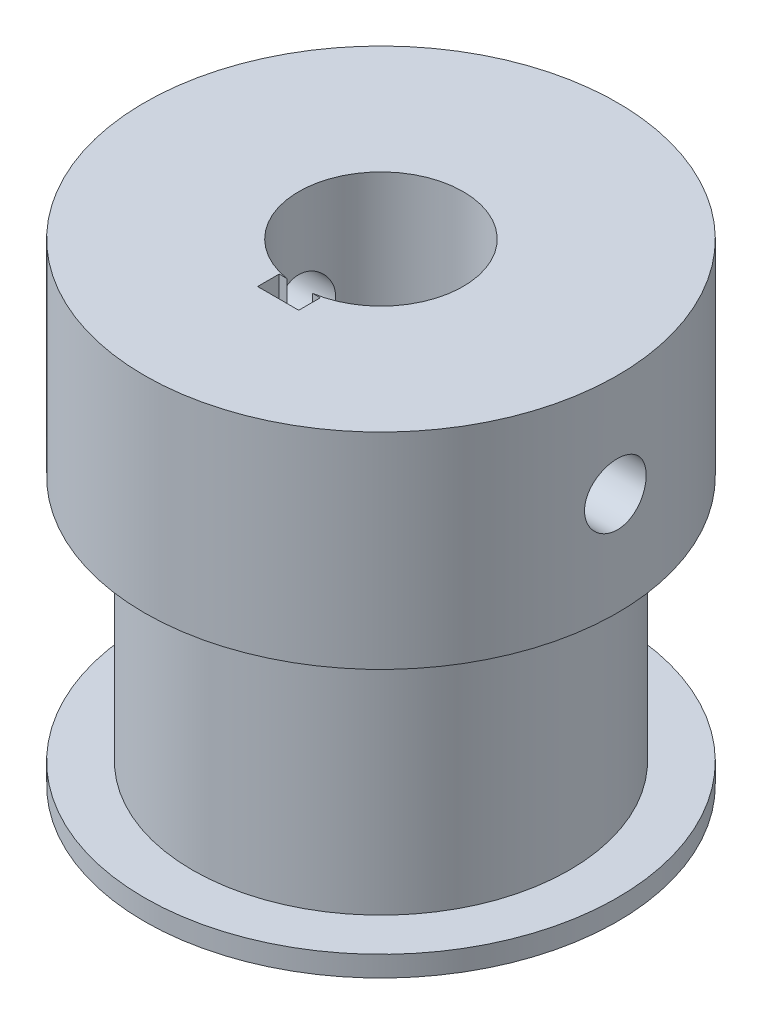
ISO-10303-21;
HEADER;
FILE_DESCRIPTION(('STEP AP214'),'2;1');
FILE_NAME('part.step','',(''),(''),'','','');
FILE_SCHEMA(('AUTOMOTIVE_DESIGN { 1 0 10303 214 1 1 1 1 }'));
ENDSEC;
DATA;
#1=APPLICATION_CONTEXT('core data for automotive mechanical design processes');
#2=APPLICATION_PROTOCOL_DEFINITION('international standard','automotive_design',2000,#1);
#3=PRODUCT_CONTEXT('',#1,'mechanical');
#4=PRODUCT('Part','Part','',(#3));
#5=PRODUCT_RELATED_PRODUCT_CATEGORY('part','',(#4));
#6=PRODUCT_DEFINITION_FORMATION('','',#4);
#7=PRODUCT_DEFINITION_CONTEXT('part definition',#1,'design');
#8=PRODUCT_DEFINITION('design','',#6,#7);
#9=PRODUCT_DEFINITION_SHAPE('','',#8);
#10=(LENGTH_UNIT() NAMED_UNIT(*) SI_UNIT(.MILLI.,.METRE.));
#11=(NAMED_UNIT(*) PLANE_ANGLE_UNIT() SI_UNIT($,.RADIAN.));
#12=(NAMED_UNIT(*) SI_UNIT($,.STERADIAN.) SOLID_ANGLE_UNIT());
#13=UNCERTAINTY_MEASURE_WITH_UNIT(LENGTH_MEASURE(1.E-05),#10,'distance_accuracy_value','');
#14=(GEOMETRIC_REPRESENTATION_CONTEXT(3) GLOBAL_UNCERTAINTY_ASSIGNED_CONTEXT((#13)) GLOBAL_UNIT_ASSIGNED_CONTEXT((#10,
#11,#12)) REPRESENTATION_CONTEXT('',''));
#15=CARTESIAN_POINT('',(0.,0.,0.));
#16=DIRECTION('',(0.,0.,1.));
#17=DIRECTION('',(1.,0.,0.));
#18=AXIS2_PLACEMENT_3D('',#15,#16,#17);
#19=CARTESIAN_POINT('',(11.5127,0.008000000000038,11.512703548781));
#20=DIRECTION('',(0.,1.,0.));
#21=DIRECTION('',(0.,0.,1.));
#22=AXIS2_PLACEMENT_3D('',#19,#20,#21);
#23=CYLINDRICAL_SURFACE('',#22,11.5);
#24=CARTESIAN_POINT('',(11.5127,0.008000000000038,11.512703548781));
#25=DIRECTION('',(0.,1.,0.));
#26=DIRECTION('',(0.,0.,1.));
#27=AXIS2_PLACEMENT_3D('',#24,#25,#26);
#28=CIRCLE('',#27,11.5);
#29=CARTESIAN_POINT('',(11.5127,0.008000000000038,23.012703548781));
#30=VERTEX_POINT('',#29);
#31=EDGE_CURVE('E19',#30,#30,#28,.T.);
#32=ORIENTED_EDGE('',*,*,#31,.T.);
#33=EDGE_LOOP('',(#32));
#34=FACE_BOUND('',#33,.T.);
#35=CARTESIAN_POINT('',(11.5127,1.008,11.512703548781));
#36=DIRECTION('',(0.,1.,0.));
#37=DIRECTION('',(0.,0.,1.));
#38=AXIS2_PLACEMENT_3D('',#35,#36,#37);
#39=CIRCLE('',#38,11.5);
#40=CARTESIAN_POINT('',(11.5127,1.008,23.012703548781));
#41=VERTEX_POINT('',#40);
#42=EDGE_CURVE('E84',#41,#41,#39,.T.);
#43=ORIENTED_EDGE('',*,*,#42,.F.);
#44=EDGE_LOOP('',(#43));
#45=FACE_BOUND('',#44,.T.);
#46=ADVANCED_FACE('F16',(#34,#45),#23,.T.);
#47=CARTESIAN_POINT('',(11.5127,1.008,11.512703548781));
#48=DIRECTION('',(0.,1.,0.));
#49=DIRECTION('',(0.,0.,1.));
#50=AXIS2_PLACEMENT_3D('',#47,#48,#49);
#51=PLANE('',#50);
#52=CARTESIAN_POINT('',(11.5127,1.008,11.512703548781));
#53=DIRECTION('',(0.,1.,0.));
#54=DIRECTION('',(0.,0.,1.));
#55=AXIS2_PLACEMENT_3D('',#52,#53,#54);
#56=CIRCLE('',#55,9.168296585514);
#57=CARTESIAN_POINT('',(11.5127,1.008,20.681000134295));
#58=VERTEX_POINT('',#57);
#59=EDGE_CURVE('E123',#58,#58,#56,.T.);
#60=ORIENTED_EDGE('',*,*,#59,.F.);
#61=EDGE_LOOP('',(#60));
#62=FACE_BOUND('',#61,.T.);
#63=ORIENTED_EDGE('',*,*,#42,.T.);
#64=EDGE_LOOP('',(#63));
#65=FACE_BOUND('',#64,.T.);
#66=ADVANCED_FACE('F199',(#62,#65),#51,.T.);
#67=CARTESIAN_POINT('',(11.5127,0.008000000000038,11.512703548781));
#68=DIRECTION('',(0.,1.,0.));
#69=DIRECTION('',(0.,0.,1.));
#70=AXIS2_PLACEMENT_3D('',#67,#68,#69);
#71=PLANE('',#70);
#72=DIRECTION('',(0.,0.,1.));
#73=VECTOR('',#72,1.);
#74=CARTESIAN_POINT('',(10.5127,0.008000000000038,15.462703548781));
#75=LINE('',#74,#73);
#76=CARTESIAN_POINT('',(10.5127,0.008000000000038,15.462703548781));
#77=VERTEX_POINT('',#76);
#78=CARTESIAN_POINT('',(10.5127,0.008000000000038,16.512703548781));
#79=VERTEX_POINT('',#78);
#80=EDGE_CURVE('E101',#77,#79,#75,.T.);
#81=ORIENTED_EDGE('',*,*,#80,.T.);
#82=DIRECTION('',(1.,0.,0.));
#83=VECTOR('',#82,1.);
#84=CARTESIAN_POINT('',(12.5127,0.008000000000038,16.512703548781));
#85=LINE('',#84,#83);
#86=CARTESIAN_POINT('',(12.5127,0.008000000000038,16.512703548781));
#87=VERTEX_POINT('',#86);
#88=EDGE_CURVE('E121',#79,#87,#85,.T.);
#89=ORIENTED_EDGE('',*,*,#88,.T.);
#90=DIRECTION('',(0.,0.,1.));
#91=VECTOR('',#90,1.);
#92=CARTESIAN_POINT('',(12.5127,0.008000000000038,15.462703548781));
#93=LINE('',#92,#91);
#94=CARTESIAN_POINT('',(12.5127,0.008000000000038,15.462703548781));
#95=VERTEX_POINT('',#94);
#96=EDGE_CURVE('E83',#95,#87,#93,.T.);
#97=ORIENTED_EDGE('',*,*,#96,.F.);
#98=DIRECTION('',(1.,0.,0.));
#99=VECTOR('',#98,1.);
#100=CARTESIAN_POINT('',(12.5127,0.008000000000038,15.462703548781));
#101=LINE('',#100,#99);
#102=CARTESIAN_POINT('',(12.143176010646,0.008000000000038,15.462703548781));
#103=VERTEX_POINT('',#102);
#104=EDGE_CURVE('E81',#103,#95,#101,.T.);
#105=ORIENTED_EDGE('',*,*,#104,.F.);
#106=CARTESIAN_POINT('',(11.5127,0.008000000000038,11.512703548781));
#107=DIRECTION('',(0.,1.,0.));
#108=DIRECTION('',(0.,0.,1.));
#109=AXIS2_PLACEMENT_3D('',#106,#107,#108);
#110=CIRCLE('',#109,4.);
#111=CARTESIAN_POINT('',(10.882223989354,0.008000000000038,15.462703548781));
#112=VERTEX_POINT('',#111);
#113=EDGE_CURVE('E74',#112,#103,#110,.F.);
#114=ORIENTED_EDGE('',*,*,#113,.F.);
#115=DIRECTION('',(1.,0.,0.));
#116=VECTOR('',#115,1.);
#117=CARTESIAN_POINT('',(12.5127,0.008000000000038,15.462703548781));
#118=LINE('',#117,#116);
#119=EDGE_CURVE('E79',#77,#112,#118,.T.);
#120=ORIENTED_EDGE('',*,*,#119,.F.);
#121=EDGE_LOOP('',(#81,#89,#97,#105,#114,#120));
#122=FACE_BOUND('',#121,.T.);
#123=ORIENTED_EDGE('',*,*,#31,.F.);
#124=EDGE_LOOP('',(#123));
#125=FACE_BOUND('',#124,.T.);
#126=ADVANCED_FACE('F76',(#122,#125),#71,.F.);
#127=CARTESIAN_POINT('',(12.5127,0.008000000000038,15.462703548781));
#128=DIRECTION('',(-1.,0.,0.));
#129=DIRECTION('',(0.,0.,1.));
#130=AXIS2_PLACEMENT_3D('',#127,#128,#129);
#131=PLANE('',#130);
#132=DIRECTION('',(0.,1.,0.));
#133=VECTOR('',#132,1.);
#134=CARTESIAN_POINT('',(12.5127,0.008000000000038,16.512703548781));
#135=LINE('',#134,#133);
#136=CARTESIAN_POINT('',(12.5127,23.008,16.512703548781));
#137=VERTEX_POINT('',#136);
#138=EDGE_CURVE('E113',#87,#137,#135,.T.);
#139=ORIENTED_EDGE('',*,*,#138,.T.);
#140=DIRECTION('',(0.,0.,1.));
#141=VECTOR('',#140,1.);
#142=CARTESIAN_POINT('',(12.5127,23.008,15.462703548781));
#143=LINE('',#142,#141);
#144=CARTESIAN_POINT('',(12.5127,23.008,15.462703548781));
#145=VERTEX_POINT('',#144);
#146=EDGE_CURVE('E109',#137,#145,#143,.F.);
#147=ORIENTED_EDGE('',*,*,#146,.T.);
#148=DIRECTION('',(0.,1.,0.));
#149=VECTOR('',#148,1.);
#150=CARTESIAN_POINT('',(12.5127,0.008000000000038,15.462703548781));
#151=LINE('',#150,#149);
#152=EDGE_CURVE('E226',#95,#145,#151,.T.);
#153=ORIENTED_EDGE('',*,*,#152,.F.);
#154=ORIENTED_EDGE('',*,*,#96,.T.);
#155=EDGE_LOOP('',(#139,#147,#153,#154));
#156=FACE_BOUND('',#155,.T.);
#157=ADVANCED_FACE('F194',(#156),#131,.T.);
#158=CARTESIAN_POINT('',(10.5127,0.008000000000038,15.462703548781));
#159=DIRECTION('',(-1.,0.,0.));
#160=DIRECTION('',(0.,0.,1.));
#161=AXIS2_PLACEMENT_3D('',#158,#159,#160);
#162=PLANE('',#161);
#163=DIRECTION('',(0.,1.,0.));
#164=VECTOR('',#163,1.);
#165=CARTESIAN_POINT('',(10.5127,0.008000000000038,16.512703548781));
#166=LINE('',#165,#164);
#167=CARTESIAN_POINT('',(10.5127,23.008,16.512703548781));
#168=VERTEX_POINT('',#167);
#169=EDGE_CURVE('E93',#168,#79,#166,.F.);
#170=ORIENTED_EDGE('',*,*,#169,.T.);
#171=ORIENTED_EDGE('',*,*,#80,.F.);
#172=DIRECTION('',(0.,1.,0.));
#173=VECTOR('',#172,1.);
#174=CARTESIAN_POINT('',(10.5127,0.008000000000038,15.462703548781));
#175=LINE('',#174,#173);
#176=CARTESIAN_POINT('',(10.5127,23.008,15.462703548781));
#177=VERTEX_POINT('',#176);
#178=EDGE_CURVE('E97',#177,#77,#175,.F.);
#179=ORIENTED_EDGE('',*,*,#178,.F.);
#180=DIRECTION('',(0.,0.,1.));
#181=VECTOR('',#180,1.);
#182=CARTESIAN_POINT('',(10.5127,23.008,15.462703548781));
#183=LINE('',#182,#181);
#184=EDGE_CURVE('E34',#168,#177,#183,.F.);
#185=ORIENTED_EDGE('',*,*,#184,.F.);
#186=EDGE_LOOP('',(#170,#171,#179,#185));
#187=FACE_BOUND('',#186,.T.);
#188=ADVANCED_FACE('F191',(#187),#162,.F.);
#189=CARTESIAN_POINT('',(12.5127,0.008000000000038,15.462703548781));
#190=DIRECTION('',(0.,0.,1.));
#191=DIRECTION('',(1.,0.,0.));
#192=AXIS2_PLACEMENT_3D('',#189,#190,#191);
#193=PLANE('',#192);
#194=DIRECTION('',(1.,0.,0.));
#195=VECTOR('',#194,1.);
#196=CARTESIAN_POINT('',(12.5127,23.008,15.462703548781));
#197=LINE('',#196,#195);
#198=CARTESIAN_POINT('',(10.882223989354,23.008,15.462703548781));
#199=VERTEX_POINT('',#198);
#200=EDGE_CURVE('E98',#199,#177,#197,.F.);
#201=ORIENTED_EDGE('',*,*,#200,.T.);
#202=ORIENTED_EDGE('',*,*,#178,.T.);
#203=ORIENTED_EDGE('',*,*,#119,.T.);
#204=DIRECTION('',(0.,1.,0.));
#205=VECTOR('',#204,1.);
#206=CARTESIAN_POINT('',(10.882223989354,13.008,15.462703548781));
#207=LINE('',#206,#205);
#208=EDGE_CURVE('E87',#112,#199,#207,.T.);
#209=ORIENTED_EDGE('',*,*,#208,.T.);
#210=EDGE_LOOP('',(#201,#202,#203,#209));
#211=FACE_BOUND('',#210,.T.);
#212=ADVANCED_FACE('F96',(#211),#193,.T.);
#213=CARTESIAN_POINT('',(12.5127,0.008000000000038,15.462703548781));
#214=DIRECTION('',(0.,0.,1.));
#215=DIRECTION('',(1.,0.,0.));
#216=AXIS2_PLACEMENT_3D('',#213,#214,#215);
#217=PLANE('',#216);
#218=DIRECTION('',(0.,1.,0.));
#219=VECTOR('',#218,1.);
#220=CARTESIAN_POINT('',(12.143176010646,13.008,15.462703548781));
#221=LINE('',#220,#219);
#222=CARTESIAN_POINT('',(12.143176010646,23.008,15.462703548781));
#223=VERTEX_POINT('',#222);
#224=EDGE_CURVE('E66',#223,#103,#221,.F.);
#225=ORIENTED_EDGE('',*,*,#224,.T.);
#226=ORIENTED_EDGE('',*,*,#104,.T.);
#227=ORIENTED_EDGE('',*,*,#152,.T.);
#228=DIRECTION('',(1.,0.,0.));
#229=VECTOR('',#228,1.);
#230=CARTESIAN_POINT('',(12.5127,23.008,15.462703548781));
#231=LINE('',#230,#229);
#232=EDGE_CURVE('E215',#145,#223,#231,.F.);
#233=ORIENTED_EDGE('',*,*,#232,.T.);
#234=EDGE_LOOP('',(#225,#226,#227,#233));
#235=FACE_BOUND('',#234,.T.);
#236=ADVANCED_FACE('F185',(#235),#217,.T.);
#237=CARTESIAN_POINT('',(11.5127,0.008000000000038,11.512703548781));
#238=DIRECTION('',(0.,1.,0.));
#239=DIRECTION('',(0.,0.,1.));
#240=AXIS2_PLACEMENT_3D('',#237,#238,#239);
#241=CYLINDRICAL_SURFACE('',#240,9.168296585514);
#242=CARTESIAN_POINT('',(11.5127,13.008,11.512703548781));
#243=DIRECTION('',(0.,1.,0.));
#244=DIRECTION('',(0.,0.,1.));
#245=AXIS2_PLACEMENT_3D('',#242,#243,#244);
#246=CIRCLE('',#245,9.168296585514);
#247=CARTESIAN_POINT('',(11.5127,13.008,20.681000134295));
#248=VERTEX_POINT('',#247);
#249=EDGE_CURVE('E216',#248,#248,#246,.F.);
#250=ORIENTED_EDGE('',*,*,#249,.T.);
#251=EDGE_LOOP('',(#250));
#252=FACE_BOUND('',#251,.T.);
#253=ORIENTED_EDGE('',*,*,#59,.T.);
#254=EDGE_LOOP('',(#253));
#255=FACE_BOUND('',#254,.T.);
#256=ADVANCED_FACE('F181',(#252,#255),#241,.T.);
#257=CARTESIAN_POINT('',(12.5127,0.008000000000038,16.512703548781));
#258=DIRECTION('',(0.,0.,1.));
#259=DIRECTION('',(1.,0.,0.));
#260=AXIS2_PLACEMENT_3D('',#257,#258,#259);
#261=PLANE('',#260);
#262=DIRECTION('',(1.,0.,0.));
#263=VECTOR('',#262,1.);
#264=CARTESIAN_POINT('',(11.5127,23.008,16.512703548781));
#265=LINE('',#264,#263);
#266=EDGE_CURVE('E116',#137,#168,#265,.F.);
#267=ORIENTED_EDGE('',*,*,#266,.F.);
#268=ORIENTED_EDGE('',*,*,#138,.F.);
#269=ORIENTED_EDGE('',*,*,#88,.F.);
#270=ORIENTED_EDGE('',*,*,#169,.F.);
#271=EDGE_LOOP('',(#267,#268,#269,#270));
#272=FACE_BOUND('',#271,.T.);
#273=ADVANCED_FACE('F176',(#272),#261,.F.);
#274=CARTESIAN_POINT('',(11.5127,13.008,11.512703548781));
#275=DIRECTION('',(0.,1.,0.));
#276=DIRECTION('',(0.,0.,1.));
#277=AXIS2_PLACEMENT_3D('',#274,#275,#276);
#278=CYLINDRICAL_SURFACE('',#277,4.);
#279=CARTESIAN_POINT('',(7.5127,19.508,11.512703548781));
#280=CARTESIAN_POINT('',(7.51270358485876,19.5079953109947,11.4315919057925));
#281=CARTESIAN_POINT('',(7.51519349886293,19.5013893874514,11.350404329142));
#282=CARTESIAN_POINT('',(7.52489945479501,19.4752066003942,11.1903673929222));
#283=CARTESIAN_POINT('',(7.53212271203636,19.4556099337961,11.1115217954867));
#284=CARTESIAN_POINT('',(7.5505135631584,19.4042423134749,10.9586343165497));
#285=CARTESIAN_POINT('',(7.56167086901631,19.372503095792,10.8845804961294));
#286=CARTESIAN_POINT('',(7.58681671625291,19.2978799190623,10.7428813915046));
#287=CARTESIAN_POINT('',(7.60080510783615,19.2549965496291,10.675235768514));
#288=CARTESIAN_POINT('',(7.63083720475945,19.1573885883814,10.5453589766785));
#289=CARTESIAN_POINT('',(7.64693923528697,19.1022722848964,10.4834357719074));
#290=CARTESIAN_POINT('',(7.67909703981789,18.982592564627,10.3694616624569));
#291=CARTESIAN_POINT('',(7.69515279556083,18.9180258320549,10.3174142375835));
#292=CARTESIAN_POINT('',(7.72607530747852,18.7782824785678,10.2227215147574));
#293=CARTESIAN_POINT('',(7.74087353294826,18.702795528038,10.1805095643814));
#294=CARTESIAN_POINT('',(7.76670141217516,18.5451515339986,10.109517040035));
#295=CARTESIAN_POINT('',(7.77773257584738,18.4629971793007,10.0807310829569));
#296=CARTESIAN_POINT('',(7.79415587544433,18.2978832238203,10.0386192309161));
#297=CARTESIAN_POINT('',(7.79976076144318,18.2150948882969,10.0247076043895));
#298=CARTESIAN_POINT('',(7.80531938536036,18.048183767561,10.0109079834512));
#299=CARTESIAN_POINT('',(7.80527546211238,17.9640615490547,10.0110141850968));
#300=CARTESIAN_POINT('',(7.79972488870721,17.8022306207418,10.0247992391347));
#301=CARTESIAN_POINT('',(7.7945453306637,17.724439383817,10.037665411382));
#302=CARTESIAN_POINT('',(7.77985065494345,17.5722131272176,10.0752617822418));
#303=CARTESIAN_POINT('',(7.77033486826138,17.4977786273778,10.0999938115825));
#304=CARTESIAN_POINT('',(7.74784271726201,17.3527212531928,10.1610667538501));
#305=CARTESIAN_POINT('',(7.73480422013274,17.2821972788822,10.1976186774273));
#306=CARTESIAN_POINT('',(7.70675720835926,17.1480513274786,10.2811450371515));
#307=CARTESIAN_POINT('',(7.69174810424395,17.0844314260555,10.3281225948507));
#308=CARTESIAN_POINT('',(7.6602221106674,16.9614061170465,10.4348770174635));
#309=CARTESIAN_POINT('',(7.64367160984375,16.902569538999,10.4953009968654));
#310=CARTESIAN_POINT('',(7.6117874515603,16.7956767659004,10.6253704736865));
#311=CARTESIAN_POINT('',(7.59645435797721,16.7476255477863,10.6950202048804));
#312=CARTESIAN_POINT('',(7.56842478356694,16.6630359563746,10.843035826115));
#313=CARTESIAN_POINT('',(7.55577477481692,16.6266955959952,10.9215240918942));
#314=CARTESIAN_POINT('',(7.53489969655296,16.5679803953585,11.0840149064005));
#315=CARTESIAN_POINT('',(7.52666568026522,16.5455773034257,11.168005915982));
#316=CARTESIAN_POINT('',(7.51833607419094,16.5230813319697,11.2961207902833));
#317=CARTESIAN_POINT('',(7.51622971738935,16.5174340689345,11.339208696247));
#318=CARTESIAN_POINT('',(7.51341072148523,16.5098921517375,11.4257583107681));
#319=CARTESIAN_POINT('',(7.51269807817584,16.5079974862486,11.4692200181969));
#320=CARTESIAN_POINT('',(7.51270358485876,16.5080046890053,11.5938151917695));
#321=CARTESIAN_POINT('',(7.51519349886293,16.5146106125486,11.67500276842));
#322=CARTESIAN_POINT('',(7.52489945479501,16.5407933996058,11.8350397046398));
#323=CARTESIAN_POINT('',(7.53212271203636,16.5603900662039,11.9138853020753));
#324=CARTESIAN_POINT('',(7.5505135631584,16.6117576865251,12.0667727810123));
#325=CARTESIAN_POINT('',(7.56167086901631,16.643496904208,12.1408266014326));
#326=CARTESIAN_POINT('',(7.58681671625291,16.7181200809377,12.2825257060574));
#327=CARTESIAN_POINT('',(7.60080510783615,16.7610034503709,12.350171329048));
#328=CARTESIAN_POINT('',(7.63083720475945,16.8586114116186,12.4800481208835));
#329=CARTESIAN_POINT('',(7.64693923528697,16.9137277151036,12.5419713256546));
#330=CARTESIAN_POINT('',(7.67909703981789,17.033407435373,12.6559454351051));
#331=CARTESIAN_POINT('',(7.69515279556083,17.0979741679451,12.7079928599785));
#332=CARTESIAN_POINT('',(7.72607530747852,17.2377175214322,12.8026855828046));
#333=CARTESIAN_POINT('',(7.74087353294826,17.313204471962,12.8448975331806));
#334=CARTESIAN_POINT('',(7.76670141217516,17.4708484660014,12.915890057527));
#335=CARTESIAN_POINT('',(7.77773257584738,17.5530028206993,12.9446760146051));
#336=CARTESIAN_POINT('',(7.79415587544433,17.7181167761797,12.9867878666459));
#337=CARTESIAN_POINT('',(7.79976076144318,17.8009051117031,13.0006994931725));
#338=CARTESIAN_POINT('',(7.80531938536036,17.967816232439,13.0144991141108));
#339=CARTESIAN_POINT('',(7.80527546211238,18.0519384509453,13.0143929124652));
#340=CARTESIAN_POINT('',(7.79972488870721,18.2137693792582,13.0006078584273));
#341=CARTESIAN_POINT('',(7.7945453306637,18.291560616183,12.98774168618));
#342=CARTESIAN_POINT('',(7.77985065494345,18.4437868727823,12.9501453153202));
#343=CARTESIAN_POINT('',(7.77033486826138,18.5182213726222,12.9254132859795));
#344=CARTESIAN_POINT('',(7.74784271726201,18.6632787468072,12.8643403437119));
#345=CARTESIAN_POINT('',(7.73480422013274,18.7338027211178,12.8277884201347));
#346=CARTESIAN_POINT('',(7.70675720835926,18.8679486725214,12.7442620604105));
#347=CARTESIAN_POINT('',(7.69174810424395,18.9315685739445,12.6972845027113));
#348=CARTESIAN_POINT('',(7.6602221106674,19.0545938829535,12.5905300800985));
#349=CARTESIAN_POINT('',(7.64367160984375,19.113430461001,12.5301061006966));
#350=CARTESIAN_POINT('',(7.6117874515603,19.2203232340996,12.4000366238755));
#351=CARTESIAN_POINT('',(7.59645435797721,19.2683744522137,12.3303868926817));
#352=CARTESIAN_POINT('',(7.56842478356694,19.3529640436254,12.182371271447));
#353=CARTESIAN_POINT('',(7.55577477481692,19.3893044040048,12.1038830056678));
#354=CARTESIAN_POINT('',(7.53489969655296,19.4480196046415,11.9413921911615));
#355=CARTESIAN_POINT('',(7.52666568026522,19.4704226965743,11.85740118158));
#356=CARTESIAN_POINT('',(7.51833607419094,19.4929186680303,11.7292863072787));
#357=CARTESIAN_POINT('',(7.51622971738935,19.4985659310655,11.686198401315));
#358=CARTESIAN_POINT('',(7.51341072148523,19.5061078482625,11.5996487867938));
#359=CARTESIAN_POINT('',(7.51269807817584,19.5080025137514,11.5561870793651));
#360=CARTESIAN_POINT('',(7.5127,19.508,11.512703548781));
#361=B_SPLINE_CURVE_WITH_KNOTS('',3,(#279,#280,#281,#282,#283,#284,#285,#286,#287,#288,#289,
#290,#291,#292,#293,#294,#295,#296,#297,#298,#299,#300,#301,#302,#303,#304,#305,#306,#307,#308,
#309,#310,#311,#312,#313,#314,#315,#316,#317,#318,#319,#320,#321,#322,#323,#324,#325,#326,#327,
#328,#329,#330,#331,#332,#333,#334,#335,#336,#337,#338,#339,#340,#341,#342,#343,#344,#345,#346,
#347,#348,#349,#350,#351,#352,#353,#354,#355,#356,#357,#358,#359,#360),.UNSPECIFIED.,.T.,.F.,(4,
2,2,2,2,2,2,2,2,2,2,2,2,2,2,2,2,2,2,2,2,2,2,2,2,2,2,2,2,2,2,2,2,2,2,2,2,2,2,2,4),(0.,
0.243166514302295,0.486704566599219,0.729610403544445,0.97250339146879,1.22473037141675,
1.47704606108122,1.73896693662271,2.00078270538428,2.25185886666104,2.50283107266743,
2.73878302477871,2.97477139254032,3.21522960902626,3.45575991877768,3.71242215551977,
3.96920258743901,4.23012113132896,4.49050903953852,4.62086973855367,4.75123004407976,
4.99439655838206,5.23793461067898,5.48084044762421,5.72373343554855,5.97596041549651,
6.22827610516098,6.49019698070247,6.75201274946405,7.0030889107408,7.25406111674719,
7.49001306885846,7.72600143662008,7.96645965310601,8.20698996285745,8.46365219959953,
8.72043263151877,8.98135117540871,9.24173908361827,9.37209978263343,9.50246008815953),.UNSPECIFIED.);
#362=CARTESIAN_POINT('',(7.5127,19.508,11.512703548781));
#363=VERTEX_POINT('',#362);
#364=EDGE_CURVE('E118',#363,#363,#361,.T.);
#365=ORIENTED_EDGE('',*,*,#364,.T.);
#366=EDGE_LOOP('',(#365));
#367=FACE_BOUND('',#366,.T.);
#368=CARTESIAN_POINT('',(15.5127,19.508,11.512703548781));
#369=CARTESIAN_POINT('',(15.5127021745615,19.5080029023031,11.5939386077189));
#370=CARTESIAN_POINT('',(15.5102037928318,19.5013802397516,11.6751537905628));
#371=CARTESIAN_POINT('',(15.5004869600693,19.4751718047301,11.8351570011334));
#372=CARTESIAN_POINT('',(15.4932691889399,19.4555878995294,11.9139453767686));
#373=CARTESIAN_POINT('',(15.4748883239154,19.4042469982282,12.0667643337719));
#374=CARTESIAN_POINT('',(15.4637328434944,19.3725134831782,12.1408037729433));
#375=CARTESIAN_POINT('',(15.4385876776535,19.2978935869842,12.2825028589412));
#376=CARTESIAN_POINT('',(15.4245972322755,19.2550042144558,12.3501607879589));
#377=CARTESIAN_POINT('',(15.3945624697122,19.1573874689291,12.4800499658268));
#378=CARTESIAN_POINT('',(15.3784600258357,19.1022697377406,12.5419742789322));
#379=CARTESIAN_POINT('',(15.3463022087133,18.9825895653412,12.6559477635246));
#380=CARTESIAN_POINT('',(15.3302468513503,18.9180242439121,12.707993912373));
#381=CARTESIAN_POINT('',(15.2993247061773,18.7782825324768,12.8026855709408));
#382=CARTESIAN_POINT('',(15.2845264882082,18.7027956334542,12.8448974807386));
#383=CARTESIAN_POINT('',(15.2586986023743,18.5451516458315,12.9158900121218));
#384=CARTESIAN_POINT('',(15.2476674297588,18.4629972368449,12.9446759983934));
#385=CARTESIAN_POINT('',(15.2312441282414,18.2978832597418,12.9867878589565));
#386=CARTESIAN_POINT('',(15.2256392435084,18.2150949615646,13.0006994809666));
#387=CARTESIAN_POINT('',(15.2200806146121,18.0481838420062,13.0144991140975));
#388=CARTESIAN_POINT('',(15.220124536593,17.9640615861255,13.0143929168073));
#389=CARTESIAN_POINT('',(15.2256751163205,17.802230474787,13.0006078448812));
#390=CARTESIAN_POINT('',(15.2308546887112,17.7244390939558,12.987741633871));
#391=CARTESIAN_POINT('',(15.2455493805953,17.5722128495947,12.9501452274643));
#392=CARTESIAN_POINT('',(15.2550651529886,17.4977784933861,12.9254132454136));
#393=CARTESIAN_POINT('',(15.2775570219025,17.3527229322718,12.8643410345));
#394=CARTESIAN_POINT('',(15.2905951798817,17.2822005138787,12.827790036152));
#395=CARTESIAN_POINT('',(15.3186421013932,17.148054262409,12.744264286408));
#396=CARTESIAN_POINT('',(15.3336515445716,17.0844328224803,12.69728593607));
#397=CARTESIAN_POINT('',(15.3651803885911,16.9613963363491,12.5905213564465));
#398=CARTESIAN_POINT('',(15.3817334745567,16.9025513592519,12.5300865359506));
#399=CARTESIAN_POINT('',(15.4136172816409,16.7956620337942,12.4000161396));
#400=CARTESIAN_POINT('',(15.4289478146595,16.7476193453943,12.3303791522784));
#401=CARTESIAN_POINT('',(15.4569639480908,16.6630696029375,12.1824269857734));
#402=CARTESIAN_POINT('',(15.4696049825962,16.6267524187789,12.1039942626257));
#403=CARTESIAN_POINT('',(15.4904871832696,16.56801739573,11.9415403993056));
#404=CARTESIAN_POINT('',(15.4987303034149,16.5455933834389,11.8575217596268));
#405=CARTESIAN_POINT('',(15.5095444322807,16.5163772124581,11.6910787919297));
#406=CARTESIAN_POINT('',(15.5123936902569,16.5088173936175,11.6088071683432));
#407=CARTESIAN_POINT('',(15.5129589370013,16.5073089361001,11.444131073526));
#408=CARTESIAN_POINT('',(15.5106760638686,16.5133572796832,11.3617266357976));
#409=CARTESIAN_POINT('',(15.5014170977264,16.5383100423087,11.2024415002191));
#410=CARTESIAN_POINT('',(15.4946247096231,16.5567115437371,11.1254702207737));
#411=CARTESIAN_POINT('',(15.4772147709172,16.6051860725473,10.9757617938238));
#412=CARTESIAN_POINT('',(15.4665967228203,16.635260617948,10.9030251984335));
#413=CARTESIAN_POINT('',(15.4421962440768,16.7071864124395,10.7614557836708));
#414=CARTESIAN_POINT('',(15.4283300020935,16.7493577292234,10.6928004652232));
#415=CARTESIAN_POINT('',(15.3989667156466,16.8439181031716,10.5633108370544));
#416=CARTESIAN_POINT('',(15.3834690700952,16.8963109325452,10.5024794285105));
#417=CARTESIAN_POINT('',(15.3514332949099,17.0134041221243,10.3866727500365));
#418=CARTESIAN_POINT('',(15.3348869650373,17.0786421827727,10.3322420075453));
#419=CARTESIAN_POINT('',(15.3034881574685,17.2176513847077,10.234993048462));
#420=CARTESIAN_POINT('',(15.288635831944,17.2914232913885,10.1921758746358));
#421=CARTESIAN_POINT('',(15.2623682982246,17.4460159867723,10.119325813591));
#422=CARTESIAN_POINT('',(15.2509676032849,17.5268647459104,10.0893466943118));
#423=CARTESIAN_POINT('',(15.2332403289101,17.6930097636878,10.0436247141121));
#424=CARTESIAN_POINT('',(15.2269106105749,17.7783032361981,10.0278730457256));
#425=CARTESIAN_POINT('',(15.2204589479257,17.9450161595411,10.0118400778026));
#426=CARTESIAN_POINT('',(15.2199644452334,18.0263326317169,10.0106302338226));
#427=CARTESIAN_POINT('',(15.2242841274529,18.1879453162762,10.0213363923651));
#428=CARTESIAN_POINT('',(15.229097808989,18.2682416246716,10.0332511502798));
#429=CARTESIAN_POINT('',(15.2431814158543,18.4230472267165,10.0691453924786));
#430=CARTESIAN_POINT('',(15.2523108537666,18.4976583462453,10.0927455656158));
#431=CARTESIAN_POINT('',(15.2739154829784,18.6419055084944,10.1510065809818));
#432=CARTESIAN_POINT('',(15.2863915199521,18.7115402880701,10.1856702193316));
#433=CARTESIAN_POINT('',(15.3140972390396,18.8478267896976,10.2671827893995));
#434=CARTESIAN_POINT('',(15.3294369844096,18.9141307967999,10.3145752207509));
#435=CARTESIAN_POINT('',(15.3607624675718,19.0381415609712,10.4193586914819));
#436=CARTESIAN_POINT('',(15.3767484094315,19.0958455747868,10.4767529086529));
#437=CARTESIAN_POINT('',(15.4086042460988,19.2042019558218,10.6036231519964));
#438=CARTESIAN_POINT('',(15.4244210490064,19.2543037534347,10.673584904568));
#439=CARTESIAN_POINT('',(15.4532451445703,19.3420226552766,10.8214903255802));
#440=CARTESIAN_POINT('',(15.4662522185156,19.3796387877364,10.8994346146904));
#441=CARTESIAN_POINT('',(15.4884429260668,19.4423768290483,11.0647044667787));
#442=CARTESIAN_POINT('',(15.4974365715836,19.4668870646019,11.1522901265468));
#443=CARTESIAN_POINT('',(15.5095624217959,19.4996929599207,11.3308278151746));
#444=CARTESIAN_POINT('',(15.5126975660397,19.5079967514873,11.4217781324161));
#445=CARTESIAN_POINT('',(15.5127,19.508,11.512703548781));
#446=B_SPLINE_CURVE_WITH_KNOTS('',3,(#368,#369,#370,#371,#372,#373,#374,#375,#376,#377,#378,
#379,#380,#381,#382,#383,#384,#385,#386,#387,#388,#389,#390,#391,#392,#393,#394,#395,#396,#397,
#398,#399,#400,#401,#402,#403,#404,#405,#406,#407,#408,#409,#410,#411,#412,#413,#414,#415,#416,
#417,#418,#419,#420,#421,#422,#423,#424,#425,#426,#427,#428,#429,#430,#431,#432,#433,#434,#435,
#436,#437,#438,#439,#440,#441,#442,#443,#444,#445),.UNSPECIFIED.,.T.,.F.,(4,2,2,2,2,2,2,2,2,2,2,
2,2,2,2,2,2,2,2,2,2,2,2,2,2,2,2,2,2,2,2,2,2,2,2,2,2,2,4),(0.,0.24336980156056,0.48670454953046,
0.729571369213573,0.972503379609489,1.22473618582716,1.47704604925622,1.73896674501659,
2.00078269352134,2.25185874416901,2.50283106079707,2.73878345119971,2.97477138060589,
3.21522408387018,3.45575990744258,3.71246153335813,3.96920257905066,4.22991375286075,
4.49050899698846,4.73725019635925,4.9839366839052,5.2211443792384,5.45838293254453,
5.70259221859599,5.94689180019868,6.20536519455657,6.46386178920141,6.72343066727203,
6.98283874956507,7.22558763480251,7.46831350211259,7.70363142426533,7.93900886656506,
8.18672471884271,8.43451941997062,8.69572329654039,8.95694749805102,9.22948515032042,
9.50188601796127),.UNSPECIFIED.);
#447=CARTESIAN_POINT('',(15.5127,19.508,11.512703548781));
#448=VERTEX_POINT('',#447);
#449=EDGE_CURVE('E167',#448,#448,#446,.T.);
#450=ORIENTED_EDGE('',*,*,#449,.T.);
#451=EDGE_LOOP('',(#450));
#452=FACE_BOUND('',#451,.T.);
#453=CARTESIAN_POINT('',(11.5127,23.008,11.512703548781));
#454=DIRECTION('',(0.,1.,0.));
#455=DIRECTION('',(0.,0.,1.));
#456=AXIS2_PLACEMENT_3D('',#453,#454,#455);
#457=CIRCLE('',#456,4.);
#458=EDGE_CURVE('E90',#199,#223,#457,.F.);
#459=ORIENTED_EDGE('',*,*,#458,.F.);
#460=ORIENTED_EDGE('',*,*,#208,.F.);
#461=ORIENTED_EDGE('',*,*,#113,.T.);
#462=ORIENTED_EDGE('',*,*,#224,.F.);
#463=EDGE_LOOP('',(#459,#460,#461,#462));
#464=FACE_BOUND('',#463,.T.);
#465=ADVANCED_FACE('F88',(#367,#452,#464),#278,.F.);
#466=CARTESIAN_POINT('',(11.5127,13.008,11.512703548781));
#467=DIRECTION('',(0.,1.,0.));
#468=DIRECTION('',(0.,0.,1.));
#469=AXIS2_PLACEMENT_3D('',#466,#467,#468);
#470=PLANE('',#469);
#471=ORIENTED_EDGE('',*,*,#249,.F.);
#472=EDGE_LOOP('',(#471));
#473=FACE_BOUND('',#472,.T.);
#474=CARTESIAN_POINT('',(11.5127,13.008,11.512703548781));
#475=DIRECTION('',(0.,1.,0.));
#476=DIRECTION('',(0.,0.,1.));
#477=AXIS2_PLACEMENT_3D('',#474,#475,#476);
#478=CIRCLE('',#477,11.5);
#479=CARTESIAN_POINT('',(11.5127,13.008,23.012703548781));
#480=VERTEX_POINT('',#479);
#481=EDGE_CURVE('E150',#480,#480,#478,.T.);
#482=ORIENTED_EDGE('',*,*,#481,.F.);
#483=EDGE_LOOP('',(#482));
#484=FACE_BOUND('',#483,.T.);
#485=ADVANCED_FACE('F175',(#473,#484),#470,.F.);
#486=CARTESIAN_POINT('',(11.5127,23.008,11.512703548781));
#487=DIRECTION('',(0.,1.,0.));
#488=DIRECTION('',(0.,0.,1.));
#489=AXIS2_PLACEMENT_3D('',#486,#487,#488);
#490=PLANE('',#489);
#491=ORIENTED_EDGE('',*,*,#184,.T.);
#492=ORIENTED_EDGE('',*,*,#200,.F.);
#493=ORIENTED_EDGE('',*,*,#458,.T.);
#494=ORIENTED_EDGE('',*,*,#232,.F.);
#495=ORIENTED_EDGE('',*,*,#146,.F.);
#496=ORIENTED_EDGE('',*,*,#266,.T.);
#497=EDGE_LOOP('',(#491,#492,#493,#494,#495,#496));
#498=FACE_BOUND('',#497,.T.);
#499=CARTESIAN_POINT('',(11.5127,23.008,11.512703548781));
#500=DIRECTION('',(0.,1.,0.));
#501=DIRECTION('',(0.,0.,1.));
#502=AXIS2_PLACEMENT_3D('',#499,#500,#501);
#503=CIRCLE('',#502,11.5);
#504=CARTESIAN_POINT('',(11.5127,23.008,23.012703548781));
#505=VERTEX_POINT('',#504);
#506=EDGE_CURVE('E25',#505,#505,#503,.F.);
#507=ORIENTED_EDGE('',*,*,#506,.F.);
#508=EDGE_LOOP('',(#507));
#509=FACE_BOUND('',#508,.T.);
#510=ADVANCED_FACE('F156',(#498,#509),#490,.T.);
#511=CARTESIAN_POINT('',(0.0127,18.008,11.512703548781));
#512=DIRECTION('',(1.,0.,0.));
#513=DIRECTION('',(0.,0.,-1.));
#514=AXIS2_PLACEMENT_3D('',#511,#512,#513);
#515=CYLINDRICAL_SURFACE('',#514,1.5);
#516=CARTESIAN_POINT('',(0.0126999999999989,16.508,11.512703548781));
#517=CARTESIAN_POINT('',(0.0127012269778836,16.5080037109735,11.4289072004961));
#518=CARTESIAN_POINT('',(0.013626274731595,16.5150511228819,11.345001414831));
#519=CARTESIAN_POINT('',(0.0172295610487932,16.5430676610452,11.179467772269));
#520=CARTESIAN_POINT('',(0.0199114345842589,16.5640656531222,11.0978450049684));
#521=CARTESIAN_POINT('',(0.0267264887485077,16.6193548536284,10.9393852698086));
#522=CARTESIAN_POINT('',(0.0308580880035117,16.6536315817157,10.8625431942229));
#523=CARTESIAN_POINT('',(0.0401126205776322,16.7344749461798,10.7157371299007));
#524=CARTESIAN_POINT('',(0.0452351464260392,16.7810365338554,10.6457703318102));
#525=CARTESIAN_POINT('',(0.0559355992329499,16.8854343853604,10.5142378011376));
#526=CARTESIAN_POINT('',(0.061515849170523,16.9433305298263,10.4527197765351));
#527=CARTESIAN_POINT('',(0.0724844032039857,17.0686279547463,10.3402407696875));
#528=CARTESIAN_POINT('',(0.0778726876253503,17.1360302059899,10.2892808669806));
#529=CARTESIAN_POINT('',(0.0878691686463862,17.2787295076709,10.1991931144502));
#530=CARTESIAN_POINT('',(0.092474439890426,17.3540545326124,10.1601092236107));
#531=CARTESIAN_POINT('',(0.100353223812161,17.5102686531111,10.0951642101122));
#532=CARTESIAN_POINT('',(0.103626803016145,17.5911574704863,10.0693024269103));
#533=CARTESIAN_POINT('',(0.108449681004405,17.7557161530676,10.031678209908));
#534=CARTESIAN_POINT('',(0.11000867632688,17.8393675941839,10.0198364587466));
#535=CARTESIAN_POINT('',(0.111255488024075,18.0074839686327,10.0103429669602));
#536=CARTESIAN_POINT('',(0.110943382878004,18.0919488676981,10.0126906311912));
#537=CARTESIAN_POINT('',(0.108492135549386,18.2587392929492,10.0314442374938));
#538=CARTESIAN_POINT('',(0.106364390340826,18.3410748705364,10.0477624867583));
#539=CARTESIAN_POINT('',(0.100539356927909,18.5018297353279,10.0938573834186));
#540=CARTESIAN_POINT('',(0.096842020633053,18.5802489024556,10.1236344431789));
#541=CARTESIAN_POINT('',(0.088281401520126,18.7312179042072,10.1958964895557));
#542=CARTESIAN_POINT('',(0.0834146103888786,18.8037491824133,10.2384198112272));
#543=CARTESIAN_POINT('',(0.0730666209662037,18.9406736929313,10.3349362338542));
#544=CARTESIAN_POINT('',(0.0675854415348531,19.0050671749228,10.3889289827746));
#545=CARTESIAN_POINT('',(0.0565763676270581,19.1243923060743,10.5073258411948));
#546=CARTESIAN_POINT('',(0.0510484258264829,19.1792509553038,10.5718035358989));
#547=CARTESIAN_POINT('',(0.0406036134480063,19.2774037793912,10.7091252827488));
#548=CARTESIAN_POINT('',(0.0356870223960092,19.32069267457,10.7819731328784));
#549=CARTESIAN_POINT('',(0.0270150088551868,19.3944734964221,10.9340440292763));
#550=CARTESIAN_POINT('',(0.0232609805631258,19.4249500735275,11.0132745876513));
#551=CARTESIAN_POINT('',(0.0173538222961353,19.4720828166113,11.1756819315429));
#552=CARTESIAN_POINT('',(0.015197305952328,19.4887682255373,11.2588499697363));
#553=CARTESIAN_POINT('',(0.0135387441623932,19.501557597659,11.370943656996));
#554=CARTESIAN_POINT('',(0.0132248567526203,19.5039716583179,11.399237376904));
#555=CARTESIAN_POINT('',(0.0128052767117387,19.5071934886642,11.4559177241828));
#556=CARTESIAN_POINT('',(0.0126995841681927,19.5080012576762,11.4843043515926));
#557=CARTESIAN_POINT('',(0.0127012269778872,19.5079962890265,11.5964998970659));
#558=CARTESIAN_POINT('',(0.0136262747315971,19.5009488771181,11.680405682731));
#559=CARTESIAN_POINT('',(0.0172295610487933,19.4729323389548,11.845939325293));
#560=CARTESIAN_POINT('',(0.0199114345842584,19.4519343468778,11.9275620925936));
#561=CARTESIAN_POINT('',(0.026726488748508,19.3966451463716,12.0860218277534));
#562=CARTESIAN_POINT('',(0.0308580880035133,19.3623684182843,12.1628639033391));
#563=CARTESIAN_POINT('',(0.0401126205776338,19.2815250538202,12.3096699676613));
#564=CARTESIAN_POINT('',(0.0452351464260394,19.2349634661446,12.3796367657518));
#565=CARTESIAN_POINT('',(0.0559355992329493,19.1305656146396,12.5111692964244));
#566=CARTESIAN_POINT('',(0.0615158491705229,19.0726694701737,12.5726873210269));
#567=CARTESIAN_POINT('',(0.0724844032039859,18.9473720452537,12.6851663278745));
#568=CARTESIAN_POINT('',(0.0778726876253503,18.8799697940101,12.7361262305814));
#569=CARTESIAN_POINT('',(0.0878691686463863,18.7372704923291,12.8262139831117));
#570=CARTESIAN_POINT('',(0.0924744398904263,18.6619454673876,12.8652978739513));
#571=CARTESIAN_POINT('',(0.100353223812161,18.5057313468889,12.9302428874498));
#572=CARTESIAN_POINT('',(0.103626803016145,18.4248425295137,12.9561046706517));
#573=CARTESIAN_POINT('',(0.108449681004404,18.2602838469324,12.993728887654));
#574=CARTESIAN_POINT('',(0.110008676326879,18.1766324058161,13.0055706388154));
#575=CARTESIAN_POINT('',(0.111255488024075,18.0085160313673,13.0150641306018));
#576=CARTESIAN_POINT('',(0.110943382878005,17.9240511323019,13.0127164663708));
#577=CARTESIAN_POINT('',(0.108492135549385,17.7572607070508,12.9939628600682));
#578=CARTESIAN_POINT('',(0.106364390340825,17.6749251294636,12.9776446108037));
#579=CARTESIAN_POINT('',(0.100539356927908,17.5141702646721,12.9315497141434));
#580=CARTESIAN_POINT('',(0.0968420206330551,17.4357510975444,12.9017726543831));
#581=CARTESIAN_POINT('',(0.0882814015201274,17.2847820957928,12.8295106080063));
#582=CARTESIAN_POINT('',(0.083414610388877,17.2122508175867,12.7869872863348));
#583=CARTESIAN_POINT('',(0.0730666209662013,17.0753263070687,12.6904708637078));
#584=CARTESIAN_POINT('',(0.0675854415348528,17.0109328250772,12.6364781147874));
#585=CARTESIAN_POINT('',(0.0565763676270592,16.8916076939257,12.5180812563672));
#586=CARTESIAN_POINT('',(0.0510484258264832,16.8367490446962,12.4536035616631));
#587=CARTESIAN_POINT('',(0.0406036134480061,16.7385962206088,12.3162818148132));
#588=CARTESIAN_POINT('',(0.0356870223960091,16.69530732543,12.2434339646836));
#589=CARTESIAN_POINT('',(0.0270150088551875,16.6215265035779,12.0913630682857));
#590=CARTESIAN_POINT('',(0.023260980563127,16.5910499264725,12.0121325099107));
#591=CARTESIAN_POINT('',(0.0173538222961354,16.5439171833887,11.8497251660191));
#592=CARTESIAN_POINT('',(0.0151973059523264,16.5272317744627,11.7665571278257));
#593=CARTESIAN_POINT('',(0.0135387441623936,16.514442402341,11.654463440566));
#594=CARTESIAN_POINT('',(0.0132248567526215,16.5120283416821,11.626169720658));
#595=CARTESIAN_POINT('',(0.0128052767117395,16.5088065113358,11.5694893733792));
#596=CARTESIAN_POINT('',(0.0126995841681923,16.5079987423238,11.5411027459694));
#597=CARTESIAN_POINT('',(0.0126999999999989,16.508,11.512703548781));
#598=B_SPLINE_CURVE_WITH_KNOTS('',3,(#516,#517,#518,#519,#520,#521,#522,#523,#524,#525,#526,
#527,#528,#529,#530,#531,#532,#533,#534,#535,#536,#537,#538,#539,#540,#541,#542,#543,#544,#545,
#546,#547,#548,#549,#550,#551,#552,#553,#554,#555,#556,#557,#558,#559,#560,#561,#562,#563,#564,
#565,#566,#567,#568,#569,#570,#571,#572,#573,#574,#575,#576,#577,#578,#579,#580,#581,#582,#583,
#584,#585,#586,#587,#588,#589,#590,#591,#592,#593,#594,#595,#596,#597),.UNSPECIFIED.,.T.,.F.,(4,
2,2,2,2,2,2,2,2,2,2,2,2,2,2,2,2,2,2,2,2,2,2,2,2,2,2,2,2,2,2,2,2,2,2,2,2,2,2,2,4),(0.,
0.251280796518462,0.503083156391798,0.75461169751499,1.00603702868847,1.25882834672884,
1.51164549922379,1.76538736244324,2.01911654812359,2.27140331292809,2.52367949619129,
2.77438366545317,3.02509551656205,3.27656909429588,3.52803495457674,3.78134852750505,
4.03477749957695,4.28850922837452,4.54170155124448,4.62686242083734,4.71202332624719,
4.96330412276565,5.21510648263899,5.46663502376218,5.71806035493566,5.97085167297604,
6.22366882547098,6.47741068869044,6.73113987437078,6.98342663917527,7.23570282243848,
7.48640699170037,7.73711884280925,7.98859242054307,8.24005828082393,8.49337185375224,
8.74680082582413,9.0005325546217,9.25372487749167,9.33888574708453,9.42404665249439),.UNSPECIFIED.);
#599=CARTESIAN_POINT('',(0.0126999999999989,16.508,11.512703548781));
#600=VERTEX_POINT('',#599);
#601=EDGE_CURVE('E144',#600,#600,#598,.T.);
#602=ORIENTED_EDGE('',*,*,#601,.F.);
#603=EDGE_LOOP('',(#602));
#604=FACE_BOUND('',#603,.T.);
#605=ORIENTED_EDGE('',*,*,#364,.F.);
#606=EDGE_LOOP('',(#605));
#607=FACE_BOUND('',#606,.T.);
#608=ADVANCED_FACE('F152',(#604,#607),#515,.F.);
#609=CARTESIAN_POINT('',(23.0127,18.008,11.512703548781));
#610=DIRECTION('',(-1.,0.,0.));
#611=DIRECTION('',(0.,0.,1.));
#612=AXIS2_PLACEMENT_3D('',#609,#610,#611);
#613=CYLINDRICAL_SURFACE('',#612,1.5);
#614=CARTESIAN_POINT('',(23.0127,16.508,11.512703548781));
#615=CARTESIAN_POINT('',(23.0126987730221,16.5080037109735,11.5964998970659));
#616=CARTESIAN_POINT('',(23.0117737252684,16.5150511228819,11.680405682731));
#617=CARTESIAN_POINT('',(23.0081704389512,16.5430676610452,11.845939325293));
#618=CARTESIAN_POINT('',(23.0054885654157,16.5640656531222,11.9275620925936));
#619=CARTESIAN_POINT('',(22.9986735112515,16.6193548536284,12.0860218277534));
#620=CARTESIAN_POINT('',(22.9945419119965,16.6536315817157,12.1628639033391));
#621=CARTESIAN_POINT('',(22.9852873794224,16.7344749461798,12.3096699676613));
#622=CARTESIAN_POINT('',(22.980164853574,16.7810365338554,12.3796367657518));
#623=CARTESIAN_POINT('',(22.9694644007671,16.8854343853604,12.5111692964244));
#624=CARTESIAN_POINT('',(22.9638841508295,16.9433305298263,12.5726873210269));
#625=CARTESIAN_POINT('',(22.952915596796,17.0686279547463,12.6851663278745));
#626=CARTESIAN_POINT('',(22.9475273123747,17.1360302059899,12.7361262305814));
#627=CARTESIAN_POINT('',(22.9375308313536,17.2787295076709,12.8262139831117));
#628=CARTESIAN_POINT('',(22.9329255601096,17.3540545326124,12.8652978739513));
#629=CARTESIAN_POINT('',(22.9250467761878,17.5102686531111,12.9302428874498));
#630=CARTESIAN_POINT('',(22.9217731969839,17.5911574704863,12.9561046706517));
#631=CARTESIAN_POINT('',(22.9169503189956,17.7557161530676,12.993728887654));
#632=CARTESIAN_POINT('',(22.9153913236731,17.8393675941839,13.0055706388154));
#633=CARTESIAN_POINT('',(22.9141445119759,18.0074839686327,13.0150641306018));
#634=CARTESIAN_POINT('',(22.914456617122,18.0919488676981,13.0127164663708));
#635=CARTESIAN_POINT('',(22.9169078644506,18.2587392929492,12.9939628600682));
#636=CARTESIAN_POINT('',(22.9190356096592,18.3410748705364,12.9776446108037));
#637=CARTESIAN_POINT('',(22.9248606430721,18.5018297353279,12.9315497141434));
#638=CARTESIAN_POINT('',(22.9285579793669,18.5802489024556,12.9017726543831));
#639=CARTESIAN_POINT('',(22.9371185984799,18.7312179042072,12.8295106080063));
#640=CARTESIAN_POINT('',(22.9419853896111,18.8037491824133,12.7869872863348));
#641=CARTESIAN_POINT('',(22.9523333790338,18.9406736929313,12.6904708637078));
#642=CARTESIAN_POINT('',(22.9578145584651,19.0050671749228,12.6364781147874));
#643=CARTESIAN_POINT('',(22.9688236323729,19.1243923060743,12.5180812563672));
#644=CARTESIAN_POINT('',(22.9743515741735,19.1792509553038,12.4536035616631));
#645=CARTESIAN_POINT('',(22.984796386552,19.2774037793912,12.3162818148132));
#646=CARTESIAN_POINT('',(22.989712977604,19.32069267457,12.2434339646836));
#647=CARTESIAN_POINT('',(22.9983849911448,19.3944734964221,12.0913630682857));
#648=CARTESIAN_POINT('',(23.0021390194369,19.4249500735275,12.0121325099107));
#649=CARTESIAN_POINT('',(23.0080461777039,19.4720828166112,11.8497251660191));
#650=CARTESIAN_POINT('',(23.0102026940477,19.4887682255373,11.7665571278257));
#651=CARTESIAN_POINT('',(23.0118612558376,19.501557597659,11.654463440566));
#652=CARTESIAN_POINT('',(23.0121751432474,19.5039716583179,11.626169720658));
#653=CARTESIAN_POINT('',(23.0125947232883,19.5071934886642,11.5694893733792));
#654=CARTESIAN_POINT('',(23.0127004158318,19.5080012576762,11.5411027459694));
#655=CARTESIAN_POINT('',(23.0126987730221,19.5079962890265,11.4289072004961));
#656=CARTESIAN_POINT('',(23.0117737252684,19.5009488771181,11.345001414831));
#657=CARTESIAN_POINT('',(23.0081704389512,19.4729323389548,11.179467772269));
#658=CARTESIAN_POINT('',(23.0054885654157,19.4519343468778,11.0978450049684));
#659=CARTESIAN_POINT('',(22.9986735112515,19.3966451463716,10.9393852698086));
#660=CARTESIAN_POINT('',(22.9945419119965,19.3623684182843,10.8625431942229));
#661=CARTESIAN_POINT('',(22.9852873794224,19.2815250538202,10.7157371299007));
#662=CARTESIAN_POINT('',(22.980164853574,19.2349634661446,10.6457703318102));
#663=CARTESIAN_POINT('',(22.9694644007671,19.1305656146396,10.5142378011376));
#664=CARTESIAN_POINT('',(22.9638841508295,19.0726694701737,10.4527197765351));
#665=CARTESIAN_POINT('',(22.952915596796,18.9473720452537,10.3402407696875));
#666=CARTESIAN_POINT('',(22.9475273123747,18.8799697940101,10.2892808669806));
#667=CARTESIAN_POINT('',(22.9375308313536,18.7372704923291,10.1991931144502));
#668=CARTESIAN_POINT('',(22.9329255601096,18.6619454673876,10.1601092236107));
#669=CARTESIAN_POINT('',(22.9250467761878,18.5057313468889,10.0951642101122));
#670=CARTESIAN_POINT('',(22.9217731969839,18.4248425295137,10.0693024269103));
#671=CARTESIAN_POINT('',(22.9169503189956,18.2602838469324,10.031678209908));
#672=CARTESIAN_POINT('',(22.9153913236731,18.1766324058161,10.0198364587466));
#673=CARTESIAN_POINT('',(22.9141445119759,18.0085160313673,10.0103429669602));
#674=CARTESIAN_POINT('',(22.914456617122,17.9240511323019,10.0126906311912));
#675=CARTESIAN_POINT('',(22.9169078644506,17.7572607070508,10.0314442374938));
#676=CARTESIAN_POINT('',(22.9190356096592,17.6749251294636,10.0477624867583));
#677=CARTESIAN_POINT('',(22.9248606430721,17.5141702646721,10.0938573834186));
#678=CARTESIAN_POINT('',(22.9285579793669,17.4357510975444,10.1236344431789));
#679=CARTESIAN_POINT('',(22.9371185984799,17.2847820957928,10.1958964895557));
#680=CARTESIAN_POINT('',(22.9419853896111,17.2122508175867,10.2384198112272));
#681=CARTESIAN_POINT('',(22.9523333790338,17.0753263070687,10.3349362338542));
#682=CARTESIAN_POINT('',(22.9578145584651,17.0109328250772,10.3889289827746));
#683=CARTESIAN_POINT('',(22.9688236323729,16.8916076939257,10.5073258411948));
#684=CARTESIAN_POINT('',(22.9743515741735,16.8367490446962,10.5718035358989));
#685=CARTESIAN_POINT('',(22.984796386552,16.7385962206088,10.7091252827488));
#686=CARTESIAN_POINT('',(22.989712977604,16.69530732543,10.7819731328784));
#687=CARTESIAN_POINT('',(22.9983849911448,16.6215265035779,10.9340440292763));
#688=CARTESIAN_POINT('',(23.0021390194369,16.5910499264725,11.0132745876513));
#689=CARTESIAN_POINT('',(23.0080461777039,16.5439171833887,11.1756819315429));
#690=CARTESIAN_POINT('',(23.0102026940477,16.5272317744627,11.2588499697363));
#691=CARTESIAN_POINT('',(23.0118612558376,16.514442402341,11.370943656996));
#692=CARTESIAN_POINT('',(23.0121751432474,16.5120283416821,11.399237376904));
#693=CARTESIAN_POINT('',(23.0125947232883,16.5088065113358,11.4559177241828));
#694=CARTESIAN_POINT('',(23.0127004158318,16.5079987423238,11.4843043515926));
#695=CARTESIAN_POINT('',(23.0127,16.508,11.512703548781));
#696=B_SPLINE_CURVE_WITH_KNOTS('',3,(#614,#615,#616,#617,#618,#619,#620,#621,#622,#623,#624,
#625,#626,#627,#628,#629,#630,#631,#632,#633,#634,#635,#636,#637,#638,#639,#640,#641,#642,#643,
#644,#645,#646,#647,#648,#649,#650,#651,#652,#653,#654,#655,#656,#657,#658,#659,#660,#661,#662,
#663,#664,#665,#666,#667,#668,#669,#670,#671,#672,#673,#674,#675,#676,#677,#678,#679,#680,#681,
#682,#683,#684,#685,#686,#687,#688,#689,#690,#691,#692,#693,#694,#695),.UNSPECIFIED.,.T.,.F.,(4,
2,2,2,2,2,2,2,2,2,2,2,2,2,2,2,2,2,2,2,2,2,2,2,2,2,2,2,2,2,2,2,2,2,2,2,2,2,2,2,4),(0.,
0.251280796518462,0.503083156391798,0.754611697514989,1.00603702868847,1.25882834672884,
1.51164549922379,1.76538736244324,2.01911654812359,2.27140331292809,2.52367949619129,
2.77438366545317,3.02509551656206,3.27656909429588,3.52803495457674,3.78134852750505,
4.03477749957695,4.28850922837452,4.54170155124447,4.62686242083734,4.71202332624719,
4.96330412276566,5.21510648263899,5.46663502376219,5.71806035493566,5.97085167297604,
6.22366882547098,6.47741068869043,6.73113987437078,6.98342663917528,7.23570282243849,
7.48640699170037,7.73711884280925,7.98859242054307,8.24005828082393,8.49337185375225,
8.74680082582414,9.00053255462171,9.25372487749167,9.33888574708453,9.42404665249439),.UNSPECIFIED.);
#697=CARTESIAN_POINT('',(23.0127,16.508,11.512703548781));
#698=VERTEX_POINT('',#697);
#699=EDGE_CURVE('E11',#698,#698,#696,.T.);
#700=ORIENTED_EDGE('',*,*,#699,.F.);
#701=EDGE_LOOP('',(#700));
#702=FACE_BOUND('',#701,.T.);
#703=ORIENTED_EDGE('',*,*,#449,.F.);
#704=EDGE_LOOP('',(#703));
#705=FACE_BOUND('',#704,.T.);
#706=ADVANCED_FACE('F136',(#702,#705),#613,.F.);
#707=CARTESIAN_POINT('',(11.5127,13.008,11.512703548781));
#708=DIRECTION('',(0.,1.,0.));
#709=DIRECTION('',(0.,0.,1.));
#710=AXIS2_PLACEMENT_3D('',#707,#708,#709);
#711=CYLINDRICAL_SURFACE('',#710,11.5);
#712=ORIENTED_EDGE('',*,*,#601,.T.);
#713=EDGE_LOOP('',(#712));
#714=FACE_BOUND('',#713,.T.);
#715=ORIENTED_EDGE('',*,*,#506,.T.);
#716=EDGE_LOOP('',(#715));
#717=FACE_BOUND('',#716,.T.);
#718=ORIENTED_EDGE('',*,*,#699,.T.);
#719=EDGE_LOOP('',(#718));
#720=FACE_BOUND('',#719,.T.);
#721=ORIENTED_EDGE('',*,*,#481,.T.);
#722=EDGE_LOOP('',(#721));
#723=FACE_BOUND('',#722,.T.);
#724=ADVANCED_FACE('F139',(#714,#717,#720,#723),#711,.T.);
#725=CLOSED_SHELL('',(#46,#66,#126,#157,#188,#212,#236,#256,#273,#465,#485,#510,#608,#706,#724));
#726=MANIFOLD_SOLID_BREP('B1',#725);
#727=ADVANCED_BREP_SHAPE_REPRESENTATION('',(#18,#726),#14);
#728=SHAPE_DEFINITION_REPRESENTATION(#9,#727);
ENDSEC;
END-ISO-10303-21;
